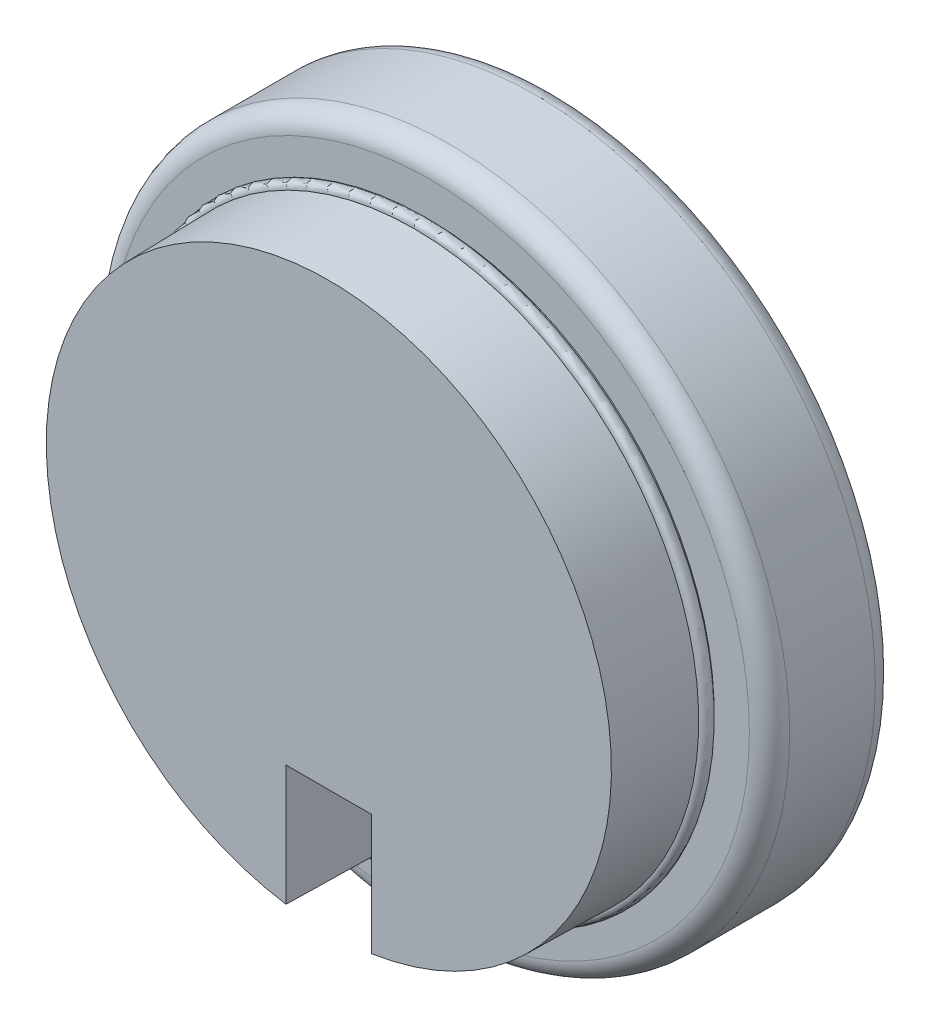
ISO-10303-21;
HEADER;
FILE_DESCRIPTION(('STEP AP214'),'2;1');
FILE_NAME('part.step','',(''),(''),'','','');
FILE_SCHEMA(('AUTOMOTIVE_DESIGN { 1 0 10303 214 1 1 1 1 }'));
ENDSEC;
DATA;
#1=APPLICATION_CONTEXT('core data for automotive mechanical design processes');
#2=APPLICATION_PROTOCOL_DEFINITION('international standard','automotive_design',2000,#1);
#3=PRODUCT_CONTEXT('',#1,'mechanical');
#4=PRODUCT('Part','Part','',(#3));
#5=PRODUCT_RELATED_PRODUCT_CATEGORY('part','',(#4));
#6=PRODUCT_DEFINITION_FORMATION('','',#4);
#7=PRODUCT_DEFINITION_CONTEXT('part definition',#1,'design');
#8=PRODUCT_DEFINITION('design','',#6,#7);
#9=PRODUCT_DEFINITION_SHAPE('','',#8);
#10=(LENGTH_UNIT() NAMED_UNIT(*) SI_UNIT(.MILLI.,.METRE.));
#11=(NAMED_UNIT(*) PLANE_ANGLE_UNIT() SI_UNIT($,.RADIAN.));
#12=(NAMED_UNIT(*) SI_UNIT($,.STERADIAN.) SOLID_ANGLE_UNIT());
#13=UNCERTAINTY_MEASURE_WITH_UNIT(LENGTH_MEASURE(1.E-05),#10,'distance_accuracy_value','');
#14=(GEOMETRIC_REPRESENTATION_CONTEXT(3) GLOBAL_UNCERTAINTY_ASSIGNED_CONTEXT((#13)) GLOBAL_UNIT_ASSIGNED_CONTEXT((#10,
#11,#12)) REPRESENTATION_CONTEXT('',''));
#15=CARTESIAN_POINT('',(0.,0.,0.));
#16=DIRECTION('',(0.,0.,1.));
#17=DIRECTION('',(1.,0.,0.));
#18=AXIS2_PLACEMENT_3D('',#15,#16,#17);
#19=CARTESIAN_POINT('',(0.,0.,9.));
#20=DIRECTION('',(0.,0.,1.));
#21=DIRECTION('',(1.,0.,0.));
#22=AXIS2_PLACEMENT_3D('',#19,#20,#21);
#23=PLANE('',#22);
#24=DIRECTION('',(0.,1.,0.));
#25=VECTOR('',#24,1.);
#26=CARTESIAN_POINT('',(-1.7,-11.6,9.));
#27=LINE('',#26,#25);
#28=CARTESIAN_POINT('',(-1.7,-6.3,9.));
#29=VERTEX_POINT('',#28);
#30=CARTESIAN_POINT('',(-1.7,-11.0904643726041,8.9999999999987));
#31=VERTEX_POINT('',#30);
#32=EDGE_CURVE('E65',#29,#31,#27,.F.);
#33=ORIENTED_EDGE('',*,*,#32,.F.);
#34=DIRECTION('',(1.,0.,0.));
#35=VECTOR('',#34,1.);
#36=CARTESIAN_POINT('',(0.,-6.3,9.));
#37=LINE('',#36,#35);
#38=CARTESIAN_POINT('',(1.7,-6.3,9.));
#39=VERTEX_POINT('',#38);
#40=EDGE_CURVE('E165',#29,#39,#37,.T.);
#41=ORIENTED_EDGE('',*,*,#40,.T.);
#42=DIRECTION('',(0.,1.,0.));
#43=VECTOR('',#42,1.);
#44=CARTESIAN_POINT('',(1.7,0.,9.));
#45=LINE('',#44,#43);
#46=CARTESIAN_POINT('',(1.7,-11.0904643726041,9.));
#47=VERTEX_POINT('',#46);
#48=EDGE_CURVE('E95',#39,#47,#45,.F.);
#49=ORIENTED_EDGE('',*,*,#48,.T.);
#50=CARTESIAN_POINT('',(0.,0.,9.));
#51=DIRECTION('',(0.,0.,-1.));
#52=DIRECTION('',(-1.,0.,0.));
#53=AXIS2_PLACEMENT_3D('',#50,#51,#52);
#54=CIRCLE('',#53,11.22);
#55=EDGE_CURVE('E20',#31,#47,#54,.T.);
#56=ORIENTED_EDGE('',*,*,#55,.F.);
#57=EDGE_LOOP('',(#33,#41,#49,#56));
#58=FACE_BOUND('',#57,.T.);
#59=ADVANCED_FACE('F17',(#58),#23,.T.);
#60=CARTESIAN_POINT('',(0.,0.,5.));
#61=DIRECTION('',(0.,0.,-1.));
#62=DIRECTION('',(1.,0.,0.));
#63=AXIS2_PLACEMENT_3D('',#60,#61,#62);
#64=CONICAL_SURFACE('',#63,11.3,0.0199973339731512);
#65=CARTESIAN_POINT('',(0.,0.,5.59971211054689));
#66=DIRECTION('',(0.,0.,1.));
#67=DIRECTION('',(1.,0.,0.));
#68=AXIS2_PLACEMENT_3D('',#65,#66,#67);
#69=CIRCLE('',#68,11.288005757789);
#70=CARTESIAN_POINT('',(-1.7,-11.1592595627021,5.59971211081118));
#71=VERTEX_POINT('',#70);
#72=CARTESIAN_POINT('',(1.7,-11.1592595627006,5.59971211081109));
#73=VERTEX_POINT('',#72);
#74=EDGE_CURVE('E141',#71,#73,#69,.F.);
#75=ORIENTED_EDGE('',*,*,#74,.F.);
#76=CARTESIAN_POINT('',(-1.7,-11.0904643726041,8.99999999999739));
#77=CARTESIAN_POINT('',(-1.7,-11.1019310462505,8.43328536820409));
#78=CARTESIAN_POINT('',(-1.7,-11.1133973155815,7.86657072823061));
#79=CARTESIAN_POINT('',(-1.7,-11.1363290456124,6.7331414319233));
#80=CARTESIAN_POINT('',(-1.7,-11.1477945063123,6.16642677558947));
#81=CARTESIAN_POINT('',(-1.7,-11.1592595626968,5.59971211107546));
#82=B_SPLINE_CURVE_WITH_KNOTS('',3,(#76,#77,#78,#79,#80,#81),.UNSPECIFIED.,.F.,.F.,(4,2,4),(0.,
1.70049187779117,3.40098375558233),.UNSPECIFIED.);
#83=EDGE_CURVE('E94',#31,#71,#82,.T.);
#84=ORIENTED_EDGE('',*,*,#83,.F.);
#85=ORIENTED_EDGE('',*,*,#55,.T.);
#86=CARTESIAN_POINT('',(1.7,-11.0904643726041,8.99999999999739));
#87=CARTESIAN_POINT('',(1.7,-11.1019310462505,8.43328536820409));
#88=CARTESIAN_POINT('',(1.7,-11.1133973155815,7.86657072823061));
#89=CARTESIAN_POINT('',(1.7,-11.1363290456124,6.73314143192329));
#90=CARTESIAN_POINT('',(1.7,-11.1477945063123,6.16642677558945));
#91=CARTESIAN_POINT('',(1.7,-11.1592595626968,5.59971211107544));
#92=B_SPLINE_CURVE_WITH_KNOTS('',3,(#86,#87,#88,#89,#90,#91),.UNSPECIFIED.,.F.,.F.,(4,2,4),(0.,
1.70049187779119,3.40098375558237),.UNSPECIFIED.);
#93=EDGE_CURVE('E111',#47,#73,#92,.T.);
#94=ORIENTED_EDGE('',*,*,#93,.T.);
#95=EDGE_LOOP('',(#75,#84,#85,#94));
#96=FACE_BOUND('',#95,.T.);
#97=ADVANCED_FACE('F107',(#96),#64,.T.);
#98=CARTESIAN_POINT('',(-1.7,-11.6,4.8));
#99=DIRECTION('',(1.,0.,0.));
#100=DIRECTION('',(0.,1.,0.));
#101=AXIS2_PLACEMENT_3D('',#98,#99,#100);
#102=PLANE('',#101);
#103=DIRECTION('',(0.,-0.0202261481633062,-0.999795430540906));
#104=VECTOR('',#103,1.);
#105=CARTESIAN_POINT('',(-1.7,-11.1693688444754,5.10000800144878));
#106=LINE('',#105,#104);
#107=CARTESIAN_POINT('',(-1.7,-11.1693688444758,5.10000800142839));
#108=VERTEX_POINT('',#107);
#109=CARTESIAN_POINT('',(-1.69999999999911,-11.1713920350143,5.));
#110=VERTEX_POINT('',#109);
#111=EDGE_CURVE('E84',#108,#110,#106,.T.);
#112=ORIENTED_EDGE('',*,*,#111,.T.);
#113=DIRECTION('',(0.,1.,0.));
#114=VECTOR('',#113,1.);
#115=CARTESIAN_POINT('',(-1.7,-11.6,5.));
#116=LINE('',#115,#114);
#117=CARTESIAN_POINT('',(-1.7,-11.6,5.));
#118=VERTEX_POINT('',#117);
#119=EDGE_CURVE('E75',#110,#118,#116,.F.);
#120=ORIENTED_EDGE('',*,*,#119,.T.);
#121=DIRECTION('',(0.,0.,1.));
#122=VECTOR('',#121,1.);
#123=CARTESIAN_POINT('',(-1.7,-11.6,4.8));
#124=LINE('',#123,#122);
#125=CARTESIAN_POINT('',(-1.7,-11.6,4.8));
#126=VERTEX_POINT('',#125);
#127=EDGE_CURVE('E38',#118,#126,#124,.F.);
#128=ORIENTED_EDGE('',*,*,#127,.T.);
#129=DIRECTION('',(0.,1.,0.));
#130=VECTOR('',#129,1.);
#131=CARTESIAN_POINT('',(-1.7,-11.6,4.8));
#132=LINE('',#131,#130);
#133=CARTESIAN_POINT('',(-1.7,-6.3,4.8));
#134=VERTEX_POINT('',#133);
#135=EDGE_CURVE('E142',#134,#126,#132,.F.);
#136=ORIENTED_EDGE('',*,*,#135,.F.);
#137=DIRECTION('',(0.,0.,1.));
#138=VECTOR('',#137,1.);
#139=CARTESIAN_POINT('',(-1.7,-6.3,4.8));
#140=LINE('',#139,#138);
#141=EDGE_CURVE('E167',#134,#29,#140,.T.);
#142=ORIENTED_EDGE('',*,*,#141,.T.);
#143=ORIENTED_EDGE('',*,*,#32,.T.);
#144=ORIENTED_EDGE('',*,*,#83,.T.);
#145=CARTESIAN_POINT('',(-1.7,-11.1693688444748,5.10000800140835));
#146=CARTESIAN_POINT('',(-1.7,-11.1550202978074,5.10011013116014));
#147=CARTESIAN_POINT('',(-1.7,-11.1406841621306,5.10144165568942));
#148=CARTESIAN_POINT('',(-1.7,-11.1124403043679,5.10647723735925));
#149=CARTESIAN_POINT('',(-1.7,-11.0985324139213,5.11018034932128));
#150=CARTESIAN_POINT('',(-1.7,-11.071528893751,5.11987582418153));
#151=CARTESIAN_POINT('',(-1.7,-11.0584337307361,5.12586948854683));
#152=CARTESIAN_POINT('',(-1.7,-11.0334457868123,5.139979005746));
#153=CARTESIAN_POINT('',(-1.7,-11.0215526651281,5.14809425476366));
#154=CARTESIAN_POINT('',(-1.7,-10.9993724692714,5.16617925123378));
#155=CARTESIAN_POINT('',(-1.7,-10.9890774904442,5.17613929945148));
#156=CARTESIAN_POINT('',(-1.7,-10.9703270972393,5.19766521805528));
#157=CARTESIAN_POINT('',(-1.7,-10.9618718779616,5.20923125853818));
#158=CARTESIAN_POINT('',(-1.7,-10.9471446083716,5.23350127163974));
#159=CARTESIAN_POINT('',(-1.7,-10.9408491814578,5.24619105857093));
#160=CARTESIAN_POINT('',(-1.7,-10.9305045858556,5.27245441236275));
#161=CARTESIAN_POINT('',(-1.7,-10.9264551268051,5.28602786472818));
#162=CARTESIAN_POINT('',(-1.7,-10.9207574608331,5.31352051602396));
#163=CARTESIAN_POINT('',(-1.7,-10.9190844528566,5.32743457878142));
#164=CARTESIAN_POINT('',(-1.7,-10.9181111182766,5.3553455000665));
#165=CARTESIAN_POINT('',(-1.7,-10.9188107504702,5.36934235715209));
#166=CARTESIAN_POINT('',(-1.7,-10.9225516579136,5.39694774160278));
#167=CARTESIAN_POINT('',(-1.7,-10.9255812072159,5.41055786072062));
#168=CARTESIAN_POINT('',(-1.7,-10.9338760177496,5.43707855079735));
#169=CARTESIAN_POINT('',(-1.7,-10.9391413033366,5.44998911413374));
#170=CARTESIAN_POINT('',(-1.7,-10.951768598485,5.47478709841316));
#171=CARTESIAN_POINT('',(-1.7,-10.9591366235072,5.48667145469501));
#172=CARTESIAN_POINT('',(-1.7,-10.97574541052,5.50904817056008));
#173=CARTESIAN_POINT('',(-1.7,-10.984986080267,5.5195405986653));
#174=CARTESIAN_POINT('',(-1.7,-11.0051657647858,5.53894094077388));
#175=CARTESIAN_POINT('',(-1.7,-11.0161194386964,5.54783360229593));
#176=CARTESIAN_POINT('',(-1.7,-11.0393560714036,5.56368290078491));
#177=CARTESIAN_POINT('',(-1.7,-11.0516397574501,5.57063847105078));
#178=CARTESIAN_POINT('',(-1.7,-11.0773421060149,5.58249837253787));
#179=CARTESIAN_POINT('',(-1.7,-11.0907728724854,5.58737641549838));
#180=CARTESIAN_POINT('',(-1.7,-11.1182384046197,5.59481882120637));
#181=CARTESIAN_POINT('',(-1.7,-11.1322718399846,5.59738803044344));
#182=CARTESIAN_POINT('',(-1.7,-11.1506826487594,5.59919690963648));
#183=CARTESIAN_POINT('',(-1.7,-11.1549695305822,5.59950904195187));
#184=CARTESIAN_POINT('',(-1.7,-11.1592595627044,5.59971211054675));
#185=B_SPLINE_CURVE_WITH_KNOTS('',3,(#145,#146,#147,#148,#149,#150,#151,#152,#153,#154,#155,
#156,#157,#158,#159,#160,#161,#162,#163,#164,#165,#166,#167,#168,#169,#170,#171,#172,#173,#174,
#175,#176,#177,#178,#179,#180,#181,#182,#183,#184),.UNSPECIFIED.,.F.,.F.,(4,2,2,2,2,2,2,2,2,2,2,
2,2,2,2,2,2,2,2,4),(0.,0.0429914488771895,0.0859657744858646,0.128964554032166,
0.171951109155165,0.214717762442011,0.257488948769034,0.299781403884045,0.342068390092868,
0.38391073561279,0.425752354504747,0.467384760997742,0.509017621035158,0.550770798116644,
0.592521919004409,0.63465214078361,0.676805516809757,0.719477487709415,0.762059674909817,
0.774948339518241),.UNSPECIFIED.);
#186=EDGE_CURVE('E152',#108,#71,#185,.T.);
#187=ORIENTED_EDGE('',*,*,#186,.F.);
#188=EDGE_LOOP('',(#112,#120,#128,#136,#142,#143,#144,#187));
#189=FACE_BOUND('',#188,.T.);
#190=ADVANCED_FACE('F79',(#189),#102,.T.);
#191=CARTESIAN_POINT('',(1.7,-11.6,4.8));
#192=DIRECTION('',(1.,0.,0.));
#193=DIRECTION('',(0.,1.,0.));
#194=AXIS2_PLACEMENT_3D('',#191,#192,#193);
#195=PLANE('',#194);
#196=CARTESIAN_POINT('',(1.70000000000032,-11.1693688444775,5.10000800144882));
#197=CARTESIAN_POINT('',(1.70000000224568,-11.1694531439142,5.09584100139469));
#198=CARTESIAN_POINT('',(1.70000000421038,-11.169537443372,5.091674001341));
#199=CARTESIAN_POINT('',(1.70000000757843,-11.1697060423298,5.0833400012336));
#200=CARTESIAN_POINT('',(1.70000000898178,-11.1697903418298,5.0791730011799));
#201=CARTESIAN_POINT('',(1.70000001122715,-11.1699589408721,5.0708390010725));
#202=CARTESIAN_POINT('',(1.70000001206916,-11.1700432404144,5.0666720010188));
#203=CARTESIAN_POINT('',(1.70000001319185,-11.1702118395412,5.0583380009114));
#204=CARTESIAN_POINT('',(1.70000001347252,-11.1702961391257,5.0541710008577));
#205=CARTESIAN_POINT('',(1.70000001347251,-11.1704647383369,5.0458370007503));
#206=CARTESIAN_POINT('',(1.70000001319184,-11.1705490379636,5.0416700006966));
#207=CARTESIAN_POINT('',(1.70000001206916,-11.1707176372593,5.03333600058921));
#208=CARTESIAN_POINT('',(1.70000001122715,-11.1708019369282,5.02916900053551));
#209=CARTESIAN_POINT('',(1.70000000898178,-11.1709705363083,5.02083500042811));
#210=CARTESIAN_POINT('',(1.70000000757842,-11.1710548360195,5.01666800037441));
#211=CARTESIAN_POINT('',(1.70000000421036,-11.171223435484,5.00833400026701));
#212=CARTESIAN_POINT('',(1.70000000224566,-11.1713077352374,5.00416700021331));
#213=CARTESIAN_POINT('',(1.70000000000029,-11.1713920350119,5.00000000016004));
#214=B_SPLINE_CURVE_WITH_KNOTS('',3,(#196,#197,#198,#199,#200,#201,#202,#203,#204,#205,#206,
#207,#208,#209,#210,#211,#212,#213),.UNSPECIFIED.,.F.,.F.,(4,2,2,2,2,2,2,2,4),(0.,
0.0125035579982284,0.0250071159990198,0.0375106740023723,0.0500142320082879,0.0625177900167648,
0.0750213480278039,0.0875249060414063,0.10002846405757),.UNSPECIFIED.);
#215=CARTESIAN_POINT('',(1.70000000000016,-11.1693688444761,5.10000800142858));
#216=VERTEX_POINT('',#215);
#217=CARTESIAN_POINT('',(1.70000000000014,-11.1713920350135,5.00000000008002));
#218=VERTEX_POINT('',#217);
#219=EDGE_CURVE('E125',#216,#218,#214,.T.);
#220=ORIENTED_EDGE('',*,*,#219,.F.);
#221=CARTESIAN_POINT('',(1.7,-11.1592595627044,5.59971211054675));
#222=CARTESIAN_POINT('',(1.7,-11.1449361483301,5.59904336755553));
#223=CARTESIAN_POINT('',(1.7,-11.1306734573087,5.59714827164653));
#224=CARTESIAN_POINT('',(1.7,-11.1026689490788,5.5910063278058));
#225=CARTESIAN_POINT('',(1.7,-11.0889269404202,5.58676035341402));
#226=CARTESIAN_POINT('',(1.7,-11.0623441654972,5.57601379349188));
#227=CARTESIAN_POINT('',(1.7,-11.0495039354827,5.56951187987242));
#228=CARTESIAN_POINT('',(1.7,-11.0251088462849,5.55443522346595));
#229=CARTESIAN_POINT('',(1.7,-11.0135536083944,5.5458610937697));
#230=CARTESIAN_POINT('',(1.7,-10.9921271392666,5.52692815537886));
#231=CARTESIAN_POINT('',(1.7,-10.9822467889107,5.51657967155926));
#232=CARTESIAN_POINT('',(1.7,-10.9643861713768,5.49435254879221));
#233=CARTESIAN_POINT('',(1.7,-10.9564061066143,5.48247374704523));
#234=CARTESIAN_POINT('',(1.7,-10.9426717006671,5.45766960987701));
#235=CARTESIAN_POINT('',(1.7,-10.9368930125914,5.44475775562651));
#236=CARTESIAN_POINT('',(1.7,-10.927611050202,5.4181415385264));
#237=CARTESIAN_POINT('',(1.7,-10.9241074839816,5.40443727759141));
#238=CARTESIAN_POINT('',(1.7,-10.9195070501429,5.37677308467086));
#239=CARTESIAN_POINT('',(1.7,-10.918386253124,5.36281712818129));
#240=CARTESIAN_POINT('',(1.7,-10.9185143309804,5.33491605997308));
#241=CARTESIAN_POINT('',(1.7,-10.9197631758431,5.32097094811934));
#242=CARTESIAN_POINT('',(1.7,-10.9245821018702,5.29354778604078));
#243=CARTESIAN_POINT('',(1.7,-10.9281425570653,5.28006804200187));
#244=CARTESIAN_POINT('',(1.7,-10.9374678303589,5.25389423111572));
#245=CARTESIAN_POINT('',(1.7,-10.9432326832813,5.24120017668408));
#246=CARTESIAN_POINT('',(1.7,-10.9568210035284,5.21690376932131));
#247=CARTESIAN_POINT('',(1.7,-10.9646521670397,5.20530572262838));
#248=CARTESIAN_POINT('',(1.7,-10.9821322047597,5.18357372261762));
#249=CARTESIAN_POINT('',(1.7,-10.9917809959951,5.17343970250536));
#250=CARTESIAN_POINT('',(1.7,-11.012720001551,5.15481644754705));
#251=CARTESIAN_POINT('',(1.7,-11.0240250679432,5.14634391593185));
#252=CARTESIAN_POINT('',(1.7,-11.0478901846288,5.13138772008884));
#253=CARTESIAN_POINT('',(1.7,-11.0604509210152,5.12490515112971));
#254=CARTESIAN_POINT('',(1.7,-11.0866275560291,5.11403769946008));
#255=CARTESIAN_POINT('',(1.7,-11.1002544712756,5.10967941311295));
#256=CARTESIAN_POINT('',(1.7,-11.1280228812635,5.10330265469639));
#257=CARTESIAN_POINT('',(1.7,-11.1421632321396,5.10127927543524));
#258=CARTESIAN_POINT('',(1.7,-11.160691510875,5.10018663786982));
#259=CARTESIAN_POINT('',(1.7,-11.1650307658062,5.10004165912342));
#260=CARTESIAN_POINT('',(1.7,-11.1693688444748,5.10000800140835));
#261=B_SPLINE_CURVE_WITH_KNOTS('',3,(#221,#222,#223,#224,#225,#226,#227,#228,#229,#230,#231,
#232,#233,#234,#235,#236,#237,#238,#239,#240,#241,#242,#243,#244,#245,#246,#247,#248,#249,#250,
#251,#252,#253,#254,#255,#256,#257,#258,#259,#260),.UNSPECIFIED.,.F.,.F.,(4,2,2,2,2,2,2,2,2,2,2,
2,2,2,2,2,2,2,2,4),(0.,0.0429621620828197,0.085908370979185,0.12887990566417,0.171838742219411,
0.21455559815286,0.257277002183875,0.299511157880443,0.341739893701607,0.383542496327869,
0.425344569509625,0.466973678095027,0.508603444343066,0.550390509023056,0.59217566661658,
0.634361492378584,0.676570495615912,0.719295191952991,0.761929930823295,0.774948758020561),.UNSPECIFIED.);
#262=EDGE_CURVE('E132',#73,#216,#261,.T.);
#263=ORIENTED_EDGE('',*,*,#262,.F.);
#264=ORIENTED_EDGE('',*,*,#93,.F.);
#265=ORIENTED_EDGE('',*,*,#48,.F.);
#266=DIRECTION('',(0.,0.,1.));
#267=VECTOR('',#266,1.);
#268=CARTESIAN_POINT('',(1.7,-6.3,4.8));
#269=LINE('',#268,#267);
#270=CARTESIAN_POINT('',(1.7,-6.3,4.8));
#271=VERTEX_POINT('',#270);
#272=EDGE_CURVE('E166',#39,#271,#269,.F.);
#273=ORIENTED_EDGE('',*,*,#272,.T.);
#274=DIRECTION('',(0.,1.,0.));
#275=VECTOR('',#274,1.);
#276=CARTESIAN_POINT('',(1.7,-11.6,4.8));
#277=LINE('',#276,#275);
#278=CARTESIAN_POINT('',(1.7,-11.6,4.8));
#279=VERTEX_POINT('',#278);
#280=EDGE_CURVE('E252',#279,#271,#277,.T.);
#281=ORIENTED_EDGE('',*,*,#280,.F.);
#282=DIRECTION('',(0.,0.,-1.));
#283=VECTOR('',#282,1.);
#284=CARTESIAN_POINT('',(1.7,-11.6,4.8));
#285=LINE('',#284,#283);
#286=CARTESIAN_POINT('',(1.7,-11.6,5.));
#287=VERTEX_POINT('',#286);
#288=EDGE_CURVE('E83',#287,#279,#285,.T.);
#289=ORIENTED_EDGE('',*,*,#288,.F.);
#290=DIRECTION('',(0.,1.,0.));
#291=VECTOR('',#290,1.);
#292=CARTESIAN_POINT('',(1.7,0.,5.));
#293=LINE('',#292,#291);
#294=EDGE_CURVE('E72',#218,#287,#293,.F.);
#295=ORIENTED_EDGE('',*,*,#294,.F.);
#296=EDGE_LOOP('',(#220,#263,#264,#265,#273,#281,#289,#295));
#297=FACE_BOUND('',#296,.T.);
#298=ADVANCED_FACE('F122',(#297),#195,.F.);
#299=CARTESIAN_POINT('',(-1.7,-6.3,4.8));
#300=DIRECTION('',(0.,1.,0.));
#301=DIRECTION('',(1.,0.,0.));
#302=AXIS2_PLACEMENT_3D('',#299,#300,#301);
#303=PLANE('',#302);
#304=ORIENTED_EDGE('',*,*,#141,.F.);
#305=DIRECTION('',(1.,0.,0.));
#306=VECTOR('',#305,1.);
#307=CARTESIAN_POINT('',(-1.7,-6.3,4.8));
#308=LINE('',#307,#306);
#309=EDGE_CURVE('E246',#271,#134,#308,.F.);
#310=ORIENTED_EDGE('',*,*,#309,.F.);
#311=ORIENTED_EDGE('',*,*,#272,.F.);
#312=ORIENTED_EDGE('',*,*,#40,.F.);
#313=EDGE_LOOP('',(#304,#310,#311,#312));
#314=FACE_BOUND('',#313,.T.);
#315=ADVANCED_FACE('F128',(#314),#303,.F.);
#316=CARTESIAN_POINT('',(0.,0.,5.35));
#317=DIRECTION('',(0.,0.,1.));
#318=DIRECTION('',(1.,0.,0.));
#319=AXIS2_PLACEMENT_3D('',#316,#317,#318);
#320=TOROIDAL_SURFACE('',#319,11.3,0.25);
#321=CARTESIAN_POINT('',(0.,0.,5.100008001408));
#322=DIRECTION('',(0.,0.,-1.));
#323=DIRECTION('',(-1.,0.,0.));
#324=AXIS2_PLACEMENT_3D('',#321,#322,#323);
#325=CIRCLE('',#324,11.2979998399718);
#326=EDGE_CURVE('E247',#108,#216,#325,.T.);
#327=ORIENTED_EDGE('',*,*,#326,.F.);
#328=ORIENTED_EDGE('',*,*,#186,.T.);
#329=ORIENTED_EDGE('',*,*,#74,.T.);
#330=ORIENTED_EDGE('',*,*,#262,.T.);
#331=EDGE_LOOP('',(#327,#328,#329,#330));
#332=FACE_BOUND('',#331,.T.);
#333=ADVANCED_FACE('F148',(#332),#320,.T.);
#334=CARTESIAN_POINT('',(-1.7,-11.6,4.8));
#335=DIRECTION('',(0.,0.,1.));
#336=DIRECTION('',(1.,0.,0.));
#337=AXIS2_PLACEMENT_3D('',#334,#335,#336);
#338=PLANE('',#337);
#339=ORIENTED_EDGE('',*,*,#280,.T.);
#340=ORIENTED_EDGE('',*,*,#309,.T.);
#341=ORIENTED_EDGE('',*,*,#135,.T.);
#342=DIRECTION('',(1.,0.,0.));
#343=VECTOR('',#342,1.);
#344=CARTESIAN_POINT('',(-1.7,-11.6,4.8));
#345=LINE('',#344,#343);
#346=EDGE_CURVE('E64',#279,#126,#345,.F.);
#347=ORIENTED_EDGE('',*,*,#346,.F.);
#348=EDGE_LOOP('',(#339,#340,#341,#347));
#349=FACE_BOUND('',#348,.T.);
#350=ADVANCED_FACE('F147',(#349),#338,.T.);
#351=CARTESIAN_POINT('',(0.,0.,5.));
#352=DIRECTION('',(0.,0.,-1.));
#353=DIRECTION('',(1.,0.,0.));
#354=AXIS2_PLACEMENT_3D('',#351,#352,#353);
#355=CONICAL_SURFACE('',#354,11.3,0.0199973339731512);
#356=ORIENTED_EDGE('',*,*,#219,.T.);
#357=CARTESIAN_POINT('',(0.,0.,5.));
#358=DIRECTION('',(0.,0.,-1.));
#359=DIRECTION('',(-1.,0.,0.));
#360=AXIS2_PLACEMENT_3D('',#357,#358,#359);
#361=CIRCLE('',#360,11.3);
#362=EDGE_CURVE('E80',#110,#218,#361,.T.);
#363=ORIENTED_EDGE('',*,*,#362,.F.);
#364=ORIENTED_EDGE('',*,*,#111,.F.);
#365=ORIENTED_EDGE('',*,*,#326,.T.);
#366=EDGE_LOOP('',(#356,#363,#364,#365));
#367=FACE_BOUND('',#366,.T.);
#368=ADVANCED_FACE('F194',(#367),#355,.T.);
#369=CARTESIAN_POINT('',(-1.7,-11.6,4.8));
#370=DIRECTION('',(0.,1.,0.));
#371=DIRECTION('',(1.,0.,0.));
#372=AXIS2_PLACEMENT_3D('',#369,#370,#371);
#373=PLANE('',#372);
#374=ORIENTED_EDGE('',*,*,#127,.F.);
#375=DIRECTION('',(1.,0.,0.));
#376=VECTOR('',#375,1.);
#377=CARTESIAN_POINT('',(0.,-11.6,5.));
#378=LINE('',#377,#376);
#379=EDGE_CURVE('E58',#287,#118,#378,.F.);
#380=ORIENTED_EDGE('',*,*,#379,.F.);
#381=ORIENTED_EDGE('',*,*,#288,.T.);
#382=ORIENTED_EDGE('',*,*,#346,.T.);
#383=EDGE_LOOP('',(#374,#380,#381,#382));
#384=FACE_BOUND('',#383,.T.);
#385=ADVANCED_FACE('F56',(#384),#373,.T.);
#386=CARTESIAN_POINT('',(0.,0.,5.));
#387=DIRECTION('',(0.,0.,1.));
#388=DIRECTION('',(1.,0.,0.));
#389=AXIS2_PLACEMENT_3D('',#386,#387,#388);
#390=PLANE('',#389);
#391=ORIENTED_EDGE('',*,*,#379,.T.);
#392=ORIENTED_EDGE('',*,*,#119,.F.);
#393=ORIENTED_EDGE('',*,*,#362,.T.);
#394=ORIENTED_EDGE('',*,*,#294,.T.);
#395=EDGE_LOOP('',(#391,#392,#393,#394));
#396=FACE_BOUND('',#395,.T.);
#397=CARTESIAN_POINT('',(0.,0.,5.));
#398=DIRECTION('',(0.,0.,1.));
#399=DIRECTION('',(1.,0.,0.));
#400=AXIS2_PLACEMENT_3D('',#397,#398,#399);
#401=CIRCLE('',#400,12.7);
#402=CARTESIAN_POINT('',(12.7,0.,5.));
#403=VERTEX_POINT('',#402);
#404=EDGE_CURVE('E76',#403,#403,#401,.F.);
#405=ORIENTED_EDGE('',*,*,#404,.F.);
#406=EDGE_LOOP('',(#405));
#407=FACE_BOUND('',#406,.T.);
#408=ADVANCED_FACE('F68',(#396,#407),#390,.T.);
#409=CARTESIAN_POINT('',(0.,0.,0.));
#410=DIRECTION('',(0.,0.,1.));
#411=DIRECTION('',(1.,0.,0.));
#412=AXIS2_PLACEMENT_3D('',#409,#410,#411);
#413=PLANE('',#412);
#414=CARTESIAN_POINT('',(0.,0.,0.));
#415=DIRECTION('',(0.,0.,-1.));
#416=DIRECTION('',(-1.,0.,0.));
#417=AXIS2_PLACEMENT_3D('',#414,#415,#416);
#418=CIRCLE('',#417,12.7);
#419=CARTESIAN_POINT('',(-12.7,0.,0.));
#420=VERTEX_POINT('',#419);
#421=EDGE_CURVE('E231',#420,#420,#418,.F.);
#422=ORIENTED_EDGE('',*,*,#421,.F.);
#423=EDGE_LOOP('',(#422));
#424=FACE_BOUND('',#423,.T.);
#425=ADVANCED_FACE('F206',(#424),#413,.F.);
#426=CARTESIAN_POINT('',(0.,0.,4.2));
#427=DIRECTION('',(0.,0.,1.));
#428=DIRECTION('',(1.,0.,0.));
#429=AXIS2_PLACEMENT_3D('',#426,#427,#428);
#430=TOROIDAL_SURFACE('',#429,12.7,0.8);
#431=CARTESIAN_POINT('',(0.,0.,4.2));
#432=DIRECTION('',(0.,0.,1.));
#433=DIRECTION('',(1.,0.,0.));
#434=AXIS2_PLACEMENT_3D('',#431,#432,#433);
#435=CIRCLE('',#434,13.5);
#436=CARTESIAN_POINT('',(13.5,0.,4.2));
#437=VERTEX_POINT('',#436);
#438=EDGE_CURVE('E30',#437,#437,#435,.F.);
#439=ORIENTED_EDGE('',*,*,#438,.F.);
#440=EDGE_LOOP('',(#439));
#441=FACE_BOUND('',#440,.T.);
#442=ORIENTED_EDGE('',*,*,#404,.T.);
#443=EDGE_LOOP('',(#442));
#444=FACE_BOUND('',#443,.T.);
#445=ADVANCED_FACE('F207',(#441,#444),#430,.T.);
#446=CARTESIAN_POINT('',(0.,0.,0.8));
#447=DIRECTION('',(0.,0.,-1.));
#448=DIRECTION('',(1.,0.,0.));
#449=AXIS2_PLACEMENT_3D('',#446,#447,#448);
#450=TOROIDAL_SURFACE('',#449,12.7,0.8);
#451=CARTESIAN_POINT('',(0.,0.,0.8));
#452=DIRECTION('',(0.,0.,1.));
#453=DIRECTION('',(1.,0.,0.));
#454=AXIS2_PLACEMENT_3D('',#451,#452,#453);
#455=CIRCLE('',#454,13.5);
#456=CARTESIAN_POINT('',(13.5,0.,0.8));
#457=VERTEX_POINT('',#456);
#458=EDGE_CURVE('E11',#457,#457,#455,.T.);
#459=ORIENTED_EDGE('',*,*,#458,.F.);
#460=EDGE_LOOP('',(#459));
#461=FACE_BOUND('',#460,.T.);
#462=ORIENTED_EDGE('',*,*,#421,.T.);
#463=EDGE_LOOP('',(#462));
#464=FACE_BOUND('',#463,.T.);
#465=ADVANCED_FACE('F213',(#461,#464),#450,.T.);
#466=CARTESIAN_POINT('',(0.,0.,0.));
#467=DIRECTION('',(0.,0.,1.));
#468=DIRECTION('',(1.,0.,0.));
#469=AXIS2_PLACEMENT_3D('',#466,#467,#468);
#470=CYLINDRICAL_SURFACE('',#469,13.5);
#471=ORIENTED_EDGE('',*,*,#438,.T.);
#472=EDGE_LOOP('',(#471));
#473=FACE_BOUND('',#472,.T.);
#474=ORIENTED_EDGE('',*,*,#458,.T.);
#475=EDGE_LOOP('',(#474));
#476=FACE_BOUND('',#475,.T.);
#477=ADVANCED_FACE('F220',(#473,#476),#470,.T.);
#478=CLOSED_SHELL('',(#59,#97,#190,#298,#315,#333,#350,#368,#385,#408,#425,#445,#465,#477));
#479=MANIFOLD_SOLID_BREP('B1',#478);
#480=ADVANCED_BREP_SHAPE_REPRESENTATION('',(#18,#479),#14);
#481=SHAPE_DEFINITION_REPRESENTATION(#9,#480);
ENDSEC;
END-ISO-10303-21;
